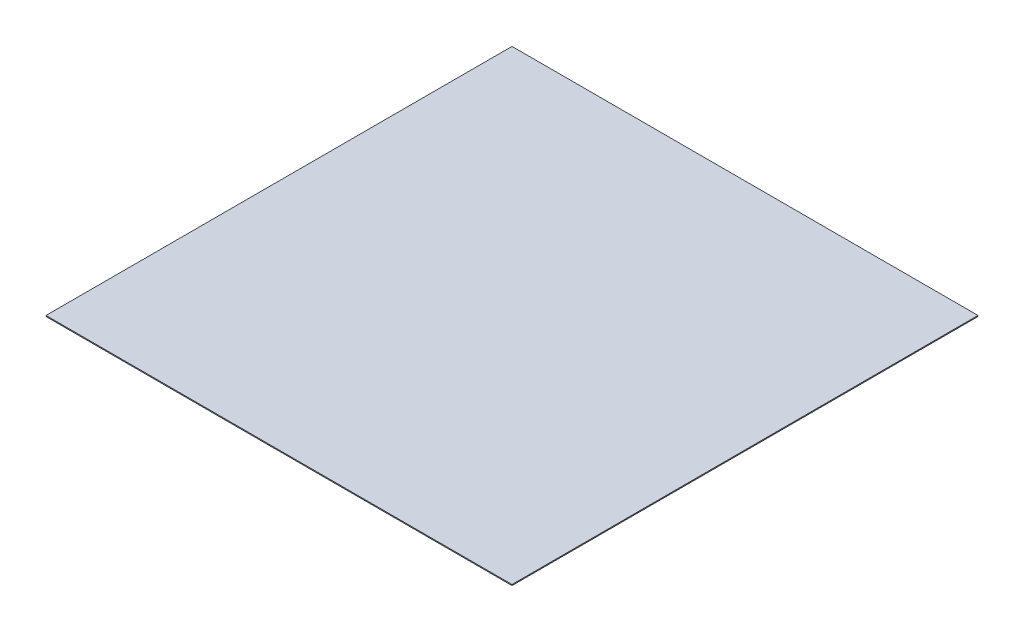
ISO-10303-21;
HEADER;
FILE_DESCRIPTION(('STEP AP214'),'2;1');
FILE_NAME('part.step','',(''),(''),'','','');
FILE_SCHEMA(('AUTOMOTIVE_DESIGN { 1 0 10303 214 1 1 1 1 }'));
ENDSEC;
DATA;
#1=APPLICATION_CONTEXT('core data for automotive mechanical design processes');
#2=APPLICATION_PROTOCOL_DEFINITION('international standard','automotive_design',2000,#1);
#3=PRODUCT_CONTEXT('',#1,'mechanical');
#4=PRODUCT('Part','Part','',(#3));
#5=PRODUCT_RELATED_PRODUCT_CATEGORY('part','',(#4));
#6=PRODUCT_DEFINITION_FORMATION('','',#4);
#7=PRODUCT_DEFINITION_CONTEXT('part definition',#1,'design');
#8=PRODUCT_DEFINITION('design','',#6,#7);
#9=PRODUCT_DEFINITION_SHAPE('','',#8);
#10=(LENGTH_UNIT() NAMED_UNIT(*) SI_UNIT(.MILLI.,.METRE.));
#11=(NAMED_UNIT(*) PLANE_ANGLE_UNIT() SI_UNIT($,.RADIAN.));
#12=(NAMED_UNIT(*) SI_UNIT($,.STERADIAN.) SOLID_ANGLE_UNIT());
#13=UNCERTAINTY_MEASURE_WITH_UNIT(LENGTH_MEASURE(1.E-05),#10,'distance_accuracy_value','');
#14=(GEOMETRIC_REPRESENTATION_CONTEXT(3) GLOBAL_UNCERTAINTY_ASSIGNED_CONTEXT((#13)) GLOBAL_UNIT_ASSIGNED_CONTEXT((#10,
#11,#12)) REPRESENTATION_CONTEXT('',''));
#15=CARTESIAN_POINT('',(0.,0.,0.));
#16=DIRECTION('',(0.,0.,1.));
#17=DIRECTION('',(1.,0.,0.));
#18=AXIS2_PLACEMENT_3D('',#15,#16,#17);
#19=CARTESIAN_POINT('',(480.,-2.,-480.));
#20=DIRECTION('',(1.,0.,0.));
#21=DIRECTION('',(0.,0.,-1.));
#22=AXIS2_PLACEMENT_3D('',#19,#20,#21);
#23=PLANE('',#22);
#24=DIRECTION('',(0.,0.,-1.));
#25=VECTOR('',#24,1.);
#26=CARTESIAN_POINT('',(480.,0.,-480.));
#27=LINE('',#26,#25);
#28=CARTESIAN_POINT('',(480.,0.,480.));
#29=VERTEX_POINT('',#28);
#30=CARTESIAN_POINT('',(480.,0.,-480.));
#31=VERTEX_POINT('',#30);
#32=EDGE_CURVE('E111',#29,#31,#27,.T.);
#33=ORIENTED_EDGE('',*,*,#32,.F.);
#34=DIRECTION('',(0.,1.,0.));
#35=VECTOR('',#34,1.);
#36=CARTESIAN_POINT('',(480.,-2.,480.));
#37=LINE('',#36,#35);
#38=CARTESIAN_POINT('',(480.,-2.,480.));
#39=VERTEX_POINT('',#38);
#40=EDGE_CURVE('E11',#39,#29,#37,.T.);
#41=ORIENTED_EDGE('',*,*,#40,.F.);
#42=DIRECTION('',(0.,0.,-1.));
#43=VECTOR('',#42,1.);
#44=CARTESIAN_POINT('',(480.,-2.,-480.));
#45=LINE('',#44,#43);
#46=CARTESIAN_POINT('',(480.,-2.,-480.));
#47=VERTEX_POINT('',#46);
#48=EDGE_CURVE('E103',#39,#47,#45,.T.);
#49=ORIENTED_EDGE('',*,*,#48,.T.);
#50=DIRECTION('',(0.,1.,0.));
#51=VECTOR('',#50,1.);
#52=CARTESIAN_POINT('',(480.,-2.,-480.));
#53=LINE('',#52,#51);
#54=EDGE_CURVE('E44',#47,#31,#53,.T.);
#55=ORIENTED_EDGE('',*,*,#54,.T.);
#56=EDGE_LOOP('',(#33,#41,#49,#55));
#57=FACE_BOUND('',#56,.T.);
#58=ADVANCED_FACE('F41',(#57),#23,.T.);
#59=CARTESIAN_POINT('',(-480.,-2.,480.));
#60=DIRECTION('',(0.,0.,1.));
#61=DIRECTION('',(1.,0.,0.));
#62=AXIS2_PLACEMENT_3D('',#59,#60,#61);
#63=PLANE('',#62);
#64=DIRECTION('',(1.,0.,0.));
#65=VECTOR('',#64,1.);
#66=CARTESIAN_POINT('',(-480.,0.,480.));
#67=LINE('',#66,#65);
#68=CARTESIAN_POINT('',(-480.,0.,480.));
#69=VERTEX_POINT('',#68);
#70=EDGE_CURVE('E106',#69,#29,#67,.T.);
#71=ORIENTED_EDGE('',*,*,#70,.F.);
#72=DIRECTION('',(0.,1.,0.));
#73=VECTOR('',#72,1.);
#74=CARTESIAN_POINT('',(-480.,-2.,480.));
#75=LINE('',#74,#73);
#76=CARTESIAN_POINT('',(-480.,-2.,480.));
#77=VERTEX_POINT('',#76);
#78=EDGE_CURVE('E51',#77,#69,#75,.T.);
#79=ORIENTED_EDGE('',*,*,#78,.F.);
#80=DIRECTION('',(1.,0.,0.));
#81=VECTOR('',#80,1.);
#82=CARTESIAN_POINT('',(-480.,-2.,480.));
#83=LINE('',#82,#81);
#84=EDGE_CURVE('E98',#77,#39,#83,.T.);
#85=ORIENTED_EDGE('',*,*,#84,.T.);
#86=ORIENTED_EDGE('',*,*,#40,.T.);
#87=EDGE_LOOP('',(#71,#79,#85,#86));
#88=FACE_BOUND('',#87,.T.);
#89=ADVANCED_FACE('F127',(#88),#63,.T.);
#90=CARTESIAN_POINT('',(-480.,-2.,-480.));
#91=DIRECTION('',(-1.,0.,0.));
#92=DIRECTION('',(0.,0.,1.));
#93=AXIS2_PLACEMENT_3D('',#90,#91,#92);
#94=PLANE('',#93);
#95=DIRECTION('',(0.,0.,1.));
#96=VECTOR('',#95,1.);
#97=CARTESIAN_POINT('',(-480.,0.,-480.));
#98=LINE('',#97,#96);
#99=CARTESIAN_POINT('',(-480.,0.,-480.));
#100=VERTEX_POINT('',#99);
#101=EDGE_CURVE('E92',#100,#69,#98,.T.);
#102=ORIENTED_EDGE('',*,*,#101,.F.);
#103=DIRECTION('',(0.,1.,0.));
#104=VECTOR('',#103,1.);
#105=CARTESIAN_POINT('',(-480.,-2.,-480.));
#106=LINE('',#105,#104);
#107=CARTESIAN_POINT('',(-480.,-2.,-480.));
#108=VERTEX_POINT('',#107);
#109=EDGE_CURVE('E87',#108,#100,#106,.T.);
#110=ORIENTED_EDGE('',*,*,#109,.F.);
#111=DIRECTION('',(0.,0.,1.));
#112=VECTOR('',#111,1.);
#113=CARTESIAN_POINT('',(-480.,-2.,-480.));
#114=LINE('',#113,#112);
#115=EDGE_CURVE('E90',#108,#77,#114,.T.);
#116=ORIENTED_EDGE('',*,*,#115,.T.);
#117=ORIENTED_EDGE('',*,*,#78,.T.);
#118=EDGE_LOOP('',(#102,#110,#116,#117));
#119=FACE_BOUND('',#118,.T.);
#120=ADVANCED_FACE('F89',(#119),#94,.T.);
#121=CARTESIAN_POINT('',(-480.,-2.,-480.));
#122=DIRECTION('',(0.,0.,-1.));
#123=DIRECTION('',(-1.,0.,0.));
#124=AXIS2_PLACEMENT_3D('',#121,#122,#123);
#125=PLANE('',#124);
#126=DIRECTION('',(-1.,0.,0.));
#127=VECTOR('',#126,1.);
#128=CARTESIAN_POINT('',(-480.,0.,-480.));
#129=LINE('',#128,#127);
#130=EDGE_CURVE('E115',#31,#100,#129,.T.);
#131=ORIENTED_EDGE('',*,*,#130,.F.);
#132=ORIENTED_EDGE('',*,*,#54,.F.);
#133=DIRECTION('',(-1.,0.,0.));
#134=VECTOR('',#133,1.);
#135=CARTESIAN_POINT('',(-480.,-2.,-480.));
#136=LINE('',#135,#134);
#137=EDGE_CURVE('E97',#47,#108,#136,.T.);
#138=ORIENTED_EDGE('',*,*,#137,.T.);
#139=ORIENTED_EDGE('',*,*,#109,.T.);
#140=EDGE_LOOP('',(#131,#132,#138,#139));
#141=FACE_BOUND('',#140,.T.);
#142=ADVANCED_FACE('F101',(#141),#125,.T.);
#143=CARTESIAN_POINT('',(0.,-2.,0.));
#144=DIRECTION('',(0.,1.,0.));
#145=DIRECTION('',(0.,0.,1.));
#146=AXIS2_PLACEMENT_3D('',#143,#144,#145);
#147=PLANE('',#146);
#148=ORIENTED_EDGE('',*,*,#48,.F.);
#149=ORIENTED_EDGE('',*,*,#84,.F.);
#150=ORIENTED_EDGE('',*,*,#115,.F.);
#151=ORIENTED_EDGE('',*,*,#137,.F.);
#152=EDGE_LOOP('',(#148,#149,#150,#151));
#153=FACE_BOUND('',#152,.T.);
#154=ADVANCED_FACE('F96',(#153),#147,.F.);
#155=CARTESIAN_POINT('',(0.,0.,0.));
#156=DIRECTION('',(0.,1.,0.));
#157=DIRECTION('',(0.,0.,1.));
#158=AXIS2_PLACEMENT_3D('',#155,#156,#157);
#159=PLANE('',#158);
#160=ORIENTED_EDGE('',*,*,#32,.T.);
#161=ORIENTED_EDGE('',*,*,#130,.T.);
#162=ORIENTED_EDGE('',*,*,#101,.T.);
#163=ORIENTED_EDGE('',*,*,#70,.T.);
#164=EDGE_LOOP('',(#160,#161,#162,#163));
#165=FACE_BOUND('',#164,.T.);
#166=ADVANCED_FACE('F126',(#165),#159,.T.);
#167=CLOSED_SHELL('',(#58,#89,#120,#142,#154,#166));
#168=MANIFOLD_SOLID_BREP('B2',#167);
#169=ADVANCED_BREP_SHAPE_REPRESENTATION('',(#18,#168),#14);
#170=SHAPE_DEFINITION_REPRESENTATION(#9,#169);
ENDSEC;
END-ISO-10303-21;
